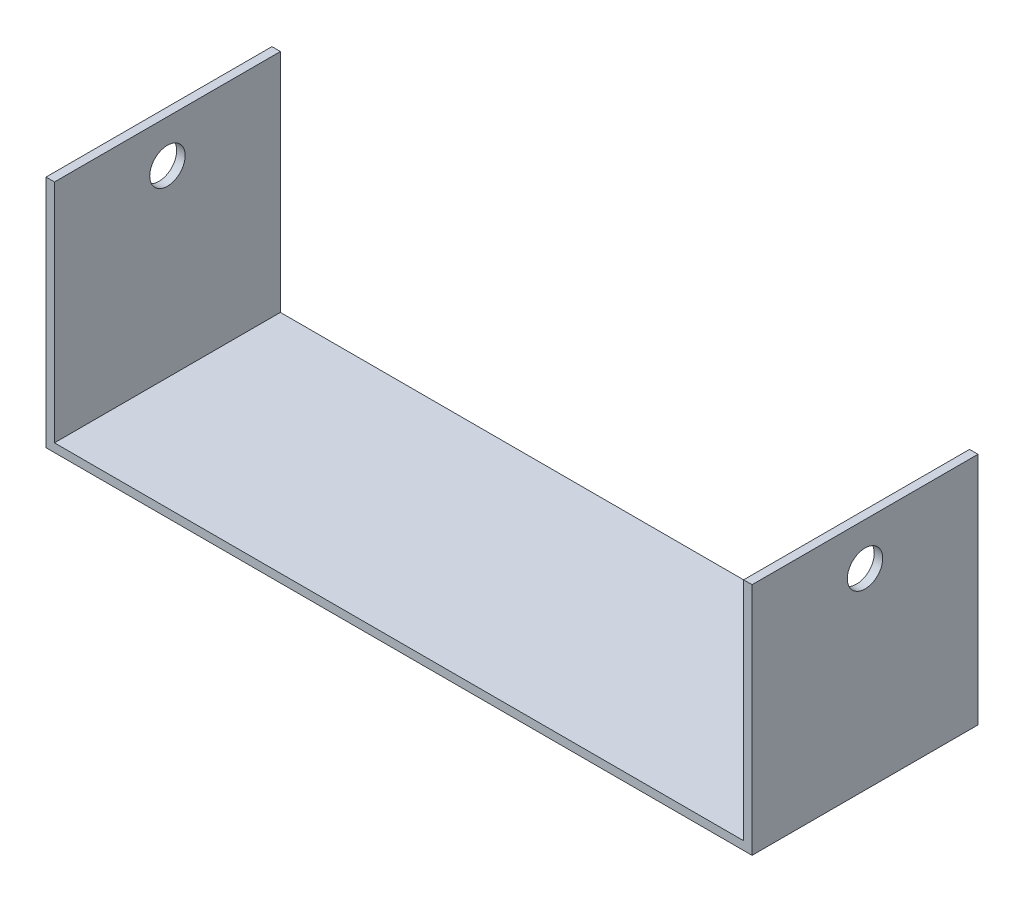
ISO-10303-21;
HEADER;
FILE_DESCRIPTION(('STEP AP214'),'2;1');
FILE_NAME('part.step','',(''),(''),'','','');
FILE_SCHEMA(('AUTOMOTIVE_DESIGN { 1 0 10303 214 1 1 1 1 }'));
ENDSEC;
DATA;
#1=APPLICATION_CONTEXT('core data for automotive mechanical design processes');
#2=APPLICATION_PROTOCOL_DEFINITION('international standard','automotive_design',2000,#1);
#3=PRODUCT_CONTEXT('',#1,'mechanical');
#4=PRODUCT('Part','Part','',(#3));
#5=PRODUCT_RELATED_PRODUCT_CATEGORY('part','',(#4));
#6=PRODUCT_DEFINITION_FORMATION('','',#4);
#7=PRODUCT_DEFINITION_CONTEXT('part definition',#1,'design');
#8=PRODUCT_DEFINITION('design','',#6,#7);
#9=PRODUCT_DEFINITION_SHAPE('','',#8);
#10=(LENGTH_UNIT() NAMED_UNIT(*) SI_UNIT(.MILLI.,.METRE.));
#11=(NAMED_UNIT(*) PLANE_ANGLE_UNIT() SI_UNIT($,.RADIAN.));
#12=(NAMED_UNIT(*) SI_UNIT($,.STERADIAN.) SOLID_ANGLE_UNIT());
#13=UNCERTAINTY_MEASURE_WITH_UNIT(LENGTH_MEASURE(1.E-05),#10,'distance_accuracy_value','');
#14=(GEOMETRIC_REPRESENTATION_CONTEXT(3) GLOBAL_UNCERTAINTY_ASSIGNED_CONTEXT((#13)) GLOBAL_UNIT_ASSIGNED_CONTEXT((#10,
#11,#12)) REPRESENTATION_CONTEXT('',''));
#15=CARTESIAN_POINT('',(0.,0.,0.));
#16=DIRECTION('',(0.,0.,1.));
#17=DIRECTION('',(1.,0.,0.));
#18=AXIS2_PLACEMENT_3D('',#15,#16,#17);
#19=CARTESIAN_POINT('',(122.,83.,80.));
#20=DIRECTION('',(1.,0.,0.));
#21=DIRECTION('',(0.,1.,0.));
#22=AXIS2_PLACEMENT_3D('',#19,#20,#21);
#23=PLANE('',#22);
#24=CARTESIAN_POINT('',(122.,67.971243919274,40.));
#25=DIRECTION('',(1.,0.,0.));
#26=DIRECTION('',(0.,1.,0.));
#27=AXIS2_PLACEMENT_3D('',#24,#25,#26);
#28=CIRCLE('',#27,6.27280661594151);
#29=CARTESIAN_POINT('',(122.,74.2440505352155,40.));
#30=VERTEX_POINT('',#29);
#31=EDGE_CURVE('E146',#30,#30,#28,.T.);
#32=ORIENTED_EDGE('',*,*,#31,.T.);
#33=EDGE_LOOP('',(#32));
#34=FACE_BOUND('',#33,.T.);
#35=DIRECTION('',(0.,-1.,0.));
#36=VECTOR('',#35,1.);
#37=CARTESIAN_POINT('',(122.,83.,0.));
#38=LINE('',#37,#36);
#39=CARTESIAN_POINT('',(122.,83.,0.));
#40=VERTEX_POINT('',#39);
#41=CARTESIAN_POINT('',(122.,3.,0.));
#42=VERTEX_POINT('',#41);
#43=EDGE_CURVE('E141',#40,#42,#38,.T.);
#44=ORIENTED_EDGE('',*,*,#43,.T.);
#45=DIRECTION('',(0.,0.,-1.));
#46=VECTOR('',#45,1.);
#47=CARTESIAN_POINT('',(122.,3.,80.));
#48=LINE('',#47,#46);
#49=CARTESIAN_POINT('',(122.,3.,80.));
#50=VERTEX_POINT('',#49);
#51=EDGE_CURVE('E11',#50,#42,#48,.T.);
#52=ORIENTED_EDGE('',*,*,#51,.F.);
#53=DIRECTION('',(0.,-1.,0.));
#54=VECTOR('',#53,1.);
#55=CARTESIAN_POINT('',(122.,83.,80.));
#56=LINE('',#55,#54);
#57=CARTESIAN_POINT('',(122.,83.,80.));
#58=VERTEX_POINT('',#57);
#59=EDGE_CURVE('E164',#58,#50,#56,.T.);
#60=ORIENTED_EDGE('',*,*,#59,.F.);
#61=DIRECTION('',(0.,0.,-1.));
#62=VECTOR('',#61,1.);
#63=CARTESIAN_POINT('',(122.,83.,80.));
#64=LINE('',#63,#62);
#65=EDGE_CURVE('E137',#58,#40,#64,.T.);
#66=ORIENTED_EDGE('',*,*,#65,.T.);
#67=EDGE_LOOP('',(#44,#52,#60,#66));
#68=FACE_BOUND('',#67,.T.);
#69=ADVANCED_FACE('F39',(#34,#68),#23,.F.);
#70=CARTESIAN_POINT('',(-122.,2.99999999999998,80.));
#71=DIRECTION('',(0.,-1.,0.));
#72=DIRECTION('',(1.,0.,0.));
#73=AXIS2_PLACEMENT_3D('',#70,#71,#72);
#74=PLANE('',#73);
#75=DIRECTION('',(-1.,0.,0.));
#76=VECTOR('',#75,1.);
#77=CARTESIAN_POINT('',(-122.,2.99999999999998,0.));
#78=LINE('',#77,#76);
#79=CARTESIAN_POINT('',(-122.,2.99999999999998,0.));
#80=VERTEX_POINT('',#79);
#81=EDGE_CURVE('E145',#42,#80,#78,.T.);
#82=ORIENTED_EDGE('',*,*,#81,.T.);
#83=DIRECTION('',(0.,0.,-1.));
#84=VECTOR('',#83,1.);
#85=CARTESIAN_POINT('',(-122.,2.99999999999998,80.));
#86=LINE('',#85,#84);
#87=CARTESIAN_POINT('',(-122.,2.99999999999998,80.));
#88=VERTEX_POINT('',#87);
#89=EDGE_CURVE('E49',#88,#80,#86,.T.);
#90=ORIENTED_EDGE('',*,*,#89,.F.);
#91=DIRECTION('',(-1.,0.,0.));
#92=VECTOR('',#91,1.);
#93=CARTESIAN_POINT('',(-122.,2.99999999999998,80.));
#94=LINE('',#93,#92);
#95=EDGE_CURVE('E100',#50,#88,#94,.T.);
#96=ORIENTED_EDGE('',*,*,#95,.F.);
#97=ORIENTED_EDGE('',*,*,#51,.T.);
#98=EDGE_LOOP('',(#82,#90,#96,#97));
#99=FACE_BOUND('',#98,.T.);
#100=ADVANCED_FACE('F235',(#99),#74,.F.);
#101=CARTESIAN_POINT('',(-122.,83.,80.));
#102=DIRECTION('',(-1.,0.,0.));
#103=DIRECTION('',(0.,-1.,0.));
#104=AXIS2_PLACEMENT_3D('',#101,#102,#103);
#105=PLANE('',#104);
#106=CARTESIAN_POINT('',(-122.,67.971243919274,40.));
#107=DIRECTION('',(-1.,0.,0.));
#108=DIRECTION('',(0.,-1.,0.));
#109=AXIS2_PLACEMENT_3D('',#106,#107,#108);
#110=CIRCLE('',#109,6.27280661594151);
#111=CARTESIAN_POINT('',(-122.,61.6984373033325,40.));
#112=VERTEX_POINT('',#111);
#113=EDGE_CURVE('E212',#112,#112,#110,.T.);
#114=ORIENTED_EDGE('',*,*,#113,.T.);
#115=EDGE_LOOP('',(#114));
#116=FACE_BOUND('',#115,.T.);
#117=DIRECTION('',(0.,1.,0.));
#118=VECTOR('',#117,1.);
#119=CARTESIAN_POINT('',(-122.,83.,0.));
#120=LINE('',#119,#118);
#121=CARTESIAN_POINT('',(-122.,83.,0.));
#122=VERTEX_POINT('',#121);
#123=EDGE_CURVE('E149',#80,#122,#120,.T.);
#124=ORIENTED_EDGE('',*,*,#123,.T.);
#125=DIRECTION('',(0.,0.,-1.));
#126=VECTOR('',#125,1.);
#127=CARTESIAN_POINT('',(-122.,83.,80.));
#128=LINE('',#127,#126);
#129=CARTESIAN_POINT('',(-122.,83.,80.));
#130=VERTEX_POINT('',#129);
#131=EDGE_CURVE('E175',#130,#122,#128,.T.);
#132=ORIENTED_EDGE('',*,*,#131,.F.);
#133=DIRECTION('',(0.,1.,0.));
#134=VECTOR('',#133,1.);
#135=CARTESIAN_POINT('',(-122.,83.,80.));
#136=LINE('',#135,#134);
#137=EDGE_CURVE('E186',#88,#130,#136,.T.);
#138=ORIENTED_EDGE('',*,*,#137,.F.);
#139=ORIENTED_EDGE('',*,*,#89,.T.);
#140=EDGE_LOOP('',(#124,#132,#138,#139));
#141=FACE_BOUND('',#140,.T.);
#142=ADVANCED_FACE('F184',(#116,#141),#105,.F.);
#143=CARTESIAN_POINT('',(-125.,83.,80.));
#144=DIRECTION('',(0.,-1.,0.));
#145=DIRECTION('',(0.,0.,-1.));
#146=AXIS2_PLACEMENT_3D('',#143,#144,#145);
#147=PLANE('',#146);
#148=DIRECTION('',(-1.,0.,0.));
#149=VECTOR('',#148,1.);
#150=CARTESIAN_POINT('',(-125.,83.,0.));
#151=LINE('',#150,#149);
#152=CARTESIAN_POINT('',(-125.,83.,0.));
#153=VERTEX_POINT('',#152);
#154=EDGE_CURVE('E152',#122,#153,#151,.T.);
#155=ORIENTED_EDGE('',*,*,#154,.T.);
#156=DIRECTION('',(0.,0.,-1.));
#157=VECTOR('',#156,1.);
#158=CARTESIAN_POINT('',(-125.,83.,80.));
#159=LINE('',#158,#157);
#160=CARTESIAN_POINT('',(-125.,83.,80.));
#161=VERTEX_POINT('',#160);
#162=EDGE_CURVE('E171',#161,#153,#159,.T.);
#163=ORIENTED_EDGE('',*,*,#162,.F.);
#164=DIRECTION('',(-1.,0.,0.));
#165=VECTOR('',#164,1.);
#166=CARTESIAN_POINT('',(-125.,83.,80.));
#167=LINE('',#166,#165);
#168=EDGE_CURVE('E199',#130,#161,#167,.T.);
#169=ORIENTED_EDGE('',*,*,#168,.F.);
#170=ORIENTED_EDGE('',*,*,#131,.T.);
#171=EDGE_LOOP('',(#155,#163,#169,#170));
#172=FACE_BOUND('',#171,.T.);
#173=ADVANCED_FACE('F194',(#172),#147,.F.);
#174=CARTESIAN_POINT('',(-125.,0.,80.));
#175=DIRECTION('',(1.,0.,0.));
#176=DIRECTION('',(0.,0.,-1.));
#177=AXIS2_PLACEMENT_3D('',#174,#175,#176);
#178=PLANE('',#177);
#179=CARTESIAN_POINT('',(-125.,67.971243919274,40.));
#180=DIRECTION('',(-1.,0.,0.));
#181=DIRECTION('',(0.,0.,1.));
#182=AXIS2_PLACEMENT_3D('',#179,#180,#181);
#183=CIRCLE('',#182,6.27280661594151);
#184=CARTESIAN_POINT('',(-125.,67.971243919274,46.2728066159415));
#185=VERTEX_POINT('',#184);
#186=EDGE_CURVE('E216',#185,#185,#183,.T.);
#187=ORIENTED_EDGE('',*,*,#186,.F.);
#188=EDGE_LOOP('',(#187));
#189=FACE_BOUND('',#188,.T.);
#190=DIRECTION('',(0.,-1.,0.));
#191=VECTOR('',#190,1.);
#192=CARTESIAN_POINT('',(-125.,0.,0.));
#193=LINE('',#192,#191);
#194=CARTESIAN_POINT('',(-125.,0.,0.));
#195=VERTEX_POINT('',#194);
#196=EDGE_CURVE('E155',#153,#195,#193,.T.);
#197=ORIENTED_EDGE('',*,*,#196,.T.);
#198=DIRECTION('',(0.,0.,-1.));
#199=VECTOR('',#198,1.);
#200=CARTESIAN_POINT('',(-125.,0.,80.));
#201=LINE('',#200,#199);
#202=CARTESIAN_POINT('',(-125.,0.,80.));
#203=VERTEX_POINT('',#202);
#204=EDGE_CURVE('E130',#203,#195,#201,.T.);
#205=ORIENTED_EDGE('',*,*,#204,.F.);
#206=DIRECTION('',(0.,-1.,0.));
#207=VECTOR('',#206,1.);
#208=CARTESIAN_POINT('',(-125.,0.,80.));
#209=LINE('',#208,#207);
#210=EDGE_CURVE('E119',#161,#203,#209,.T.);
#211=ORIENTED_EDGE('',*,*,#210,.F.);
#212=ORIENTED_EDGE('',*,*,#162,.T.);
#213=EDGE_LOOP('',(#197,#205,#211,#212));
#214=FACE_BOUND('',#213,.T.);
#215=ADVANCED_FACE('F197',(#189,#214),#178,.F.);
#216=CARTESIAN_POINT('',(125.,0.,80.));
#217=DIRECTION('',(0.,1.,0.));
#218=DIRECTION('',(-1.,0.,0.));
#219=AXIS2_PLACEMENT_3D('',#216,#217,#218);
#220=PLANE('',#219);
#221=DIRECTION('',(1.,0.,0.));
#222=VECTOR('',#221,1.);
#223=CARTESIAN_POINT('',(125.,0.,0.));
#224=LINE('',#223,#222);
#225=CARTESIAN_POINT('',(125.,0.,0.));
#226=VERTEX_POINT('',#225);
#227=EDGE_CURVE('E128',#195,#226,#224,.T.);
#228=ORIENTED_EDGE('',*,*,#227,.T.);
#229=DIRECTION('',(0.,0.,-1.));
#230=VECTOR('',#229,1.);
#231=CARTESIAN_POINT('',(125.,0.,80.));
#232=LINE('',#231,#230);
#233=CARTESIAN_POINT('',(125.,0.,80.));
#234=VERTEX_POINT('',#233);
#235=EDGE_CURVE('E125',#234,#226,#232,.T.);
#236=ORIENTED_EDGE('',*,*,#235,.F.);
#237=DIRECTION('',(1.,0.,0.));
#238=VECTOR('',#237,1.);
#239=CARTESIAN_POINT('',(125.,0.,80.));
#240=LINE('',#239,#238);
#241=EDGE_CURVE('E113',#203,#234,#240,.T.);
#242=ORIENTED_EDGE('',*,*,#241,.F.);
#243=ORIENTED_EDGE('',*,*,#204,.T.);
#244=EDGE_LOOP('',(#228,#236,#242,#243));
#245=FACE_BOUND('',#244,.T.);
#246=ADVANCED_FACE('F126',(#245),#220,.F.);
#247=CARTESIAN_POINT('',(125.,0.,80.));
#248=DIRECTION('',(-1.,0.,0.));
#249=DIRECTION('',(0.,0.,1.));
#250=AXIS2_PLACEMENT_3D('',#247,#248,#249);
#251=PLANE('',#250);
#252=CARTESIAN_POINT('',(125.,67.971243919274,40.));
#253=DIRECTION('',(-1.,0.,0.));
#254=DIRECTION('',(0.,0.,1.));
#255=AXIS2_PLACEMENT_3D('',#252,#253,#254);
#256=CIRCLE('',#255,6.27280661594151);
#257=CARTESIAN_POINT('',(125.,67.971243919274,46.2728066159415));
#258=VERTEX_POINT('',#257);
#259=EDGE_CURVE('E42',#258,#258,#256,.T.);
#260=ORIENTED_EDGE('',*,*,#259,.T.);
#261=EDGE_LOOP('',(#260));
#262=FACE_BOUND('',#261,.T.);
#263=DIRECTION('',(0.,1.,0.));
#264=VECTOR('',#263,1.);
#265=CARTESIAN_POINT('',(125.,0.,0.));
#266=LINE('',#265,#264);
#267=CARTESIAN_POINT('',(125.,83.,0.));
#268=VERTEX_POINT('',#267);
#269=EDGE_CURVE('E86',#226,#268,#266,.T.);
#270=ORIENTED_EDGE('',*,*,#269,.T.);
#271=DIRECTION('',(0.,0.,-1.));
#272=VECTOR('',#271,1.);
#273=CARTESIAN_POINT('',(125.,83.,80.));
#274=LINE('',#273,#272);
#275=CARTESIAN_POINT('',(125.,83.,80.));
#276=VERTEX_POINT('',#275);
#277=EDGE_CURVE('E131',#276,#268,#274,.T.);
#278=ORIENTED_EDGE('',*,*,#277,.F.);
#279=DIRECTION('',(0.,1.,0.));
#280=VECTOR('',#279,1.);
#281=CARTESIAN_POINT('',(125.,0.,80.));
#282=LINE('',#281,#280);
#283=EDGE_CURVE('E117',#234,#276,#282,.T.);
#284=ORIENTED_EDGE('',*,*,#283,.F.);
#285=ORIENTED_EDGE('',*,*,#235,.T.);
#286=EDGE_LOOP('',(#270,#278,#284,#285));
#287=FACE_BOUND('',#286,.T.);
#288=ADVANCED_FACE('F133',(#262,#287),#251,.F.);
#289=CARTESIAN_POINT('',(125.,83.,80.));
#290=DIRECTION('',(0.,-1.,0.));
#291=DIRECTION('',(0.,0.,-1.));
#292=AXIS2_PLACEMENT_3D('',#289,#290,#291);
#293=PLANE('',#292);
#294=DIRECTION('',(-1.,0.,0.));
#295=VECTOR('',#294,1.);
#296=CARTESIAN_POINT('',(125.,83.,0.));
#297=LINE('',#296,#295);
#298=EDGE_CURVE('E92',#268,#40,#297,.T.);
#299=ORIENTED_EDGE('',*,*,#298,.T.);
#300=ORIENTED_EDGE('',*,*,#65,.F.);
#301=DIRECTION('',(-1.,0.,0.));
#302=VECTOR('',#301,1.);
#303=CARTESIAN_POINT('',(125.,83.,80.));
#304=LINE('',#303,#302);
#305=EDGE_CURVE('E57',#276,#58,#304,.T.);
#306=ORIENTED_EDGE('',*,*,#305,.F.);
#307=ORIENTED_EDGE('',*,*,#277,.T.);
#308=EDGE_LOOP('',(#299,#300,#306,#307));
#309=FACE_BOUND('',#308,.T.);
#310=ADVANCED_FACE('F238',(#309),#293,.F.);
#311=CARTESIAN_POINT('',(0.,0.,80.));
#312=DIRECTION('',(0.,0.,1.));
#313=DIRECTION('',(1.,0.,0.));
#314=AXIS2_PLACEMENT_3D('',#311,#312,#313);
#315=PLANE('',#314);
#316=ORIENTED_EDGE('',*,*,#59,.T.);
#317=ORIENTED_EDGE('',*,*,#95,.T.);
#318=ORIENTED_EDGE('',*,*,#137,.T.);
#319=ORIENTED_EDGE('',*,*,#168,.T.);
#320=ORIENTED_EDGE('',*,*,#210,.T.);
#321=ORIENTED_EDGE('',*,*,#241,.T.);
#322=ORIENTED_EDGE('',*,*,#283,.T.);
#323=ORIENTED_EDGE('',*,*,#305,.T.);
#324=EDGE_LOOP('',(#316,#317,#318,#319,#320,#321,#322,#323));
#325=FACE_BOUND('',#324,.T.);
#326=ADVANCED_FACE('F115',(#325),#315,.T.);
#327=CARTESIAN_POINT('',(0.,0.,0.));
#328=DIRECTION('',(0.,0.,1.));
#329=DIRECTION('',(1.,0.,0.));
#330=AXIS2_PLACEMENT_3D('',#327,#328,#329);
#331=PLANE('',#330);
#332=ORIENTED_EDGE('',*,*,#43,.F.);
#333=ORIENTED_EDGE('',*,*,#298,.F.);
#334=ORIENTED_EDGE('',*,*,#269,.F.);
#335=ORIENTED_EDGE('',*,*,#227,.F.);
#336=ORIENTED_EDGE('',*,*,#196,.F.);
#337=ORIENTED_EDGE('',*,*,#154,.F.);
#338=ORIENTED_EDGE('',*,*,#123,.F.);
#339=ORIENTED_EDGE('',*,*,#81,.F.);
#340=EDGE_LOOP('',(#332,#333,#334,#335,#336,#337,#338,#339));
#341=FACE_BOUND('',#340,.T.);
#342=ADVANCED_FACE('F190',(#341),#331,.F.);
#343=CARTESIAN_POINT('',(375.,67.971243919274,40.));
#344=DIRECTION('',(-1.,0.,0.));
#345=DIRECTION('',(0.,0.,1.));
#346=AXIS2_PLACEMENT_3D('',#343,#344,#345);
#347=CYLINDRICAL_SURFACE('',#346,6.27280661594151);
#348=ORIENTED_EDGE('',*,*,#259,.F.);
#349=EDGE_LOOP('',(#348));
#350=FACE_BOUND('',#349,.T.);
#351=ORIENTED_EDGE('',*,*,#31,.F.);
#352=EDGE_LOOP('',(#351));
#353=FACE_BOUND('',#352,.T.);
#354=ADVANCED_FACE('F226',(#350,#353),#347,.F.);
#355=ORIENTED_EDGE('',*,*,#186,.T.);
#356=EDGE_LOOP('',(#355));
#357=FACE_BOUND('',#356,.T.);
#358=ORIENTED_EDGE('',*,*,#113,.F.);
#359=EDGE_LOOP('',(#358));
#360=FACE_BOUND('',#359,.T.);
#361=ADVANCED_FACE('F229',(#357,#360),#347,.F.);
#362=CLOSED_SHELL('',(#69,#100,#142,#173,#215,#246,#288,#310,#326,#342,#354,#361));
#363=MANIFOLD_SOLID_BREP('B2',#362);
#364=ADVANCED_BREP_SHAPE_REPRESENTATION('',(#18,#363),#14);
#365=SHAPE_DEFINITION_REPRESENTATION(#9,#364);
ENDSEC;
END-ISO-10303-21;
